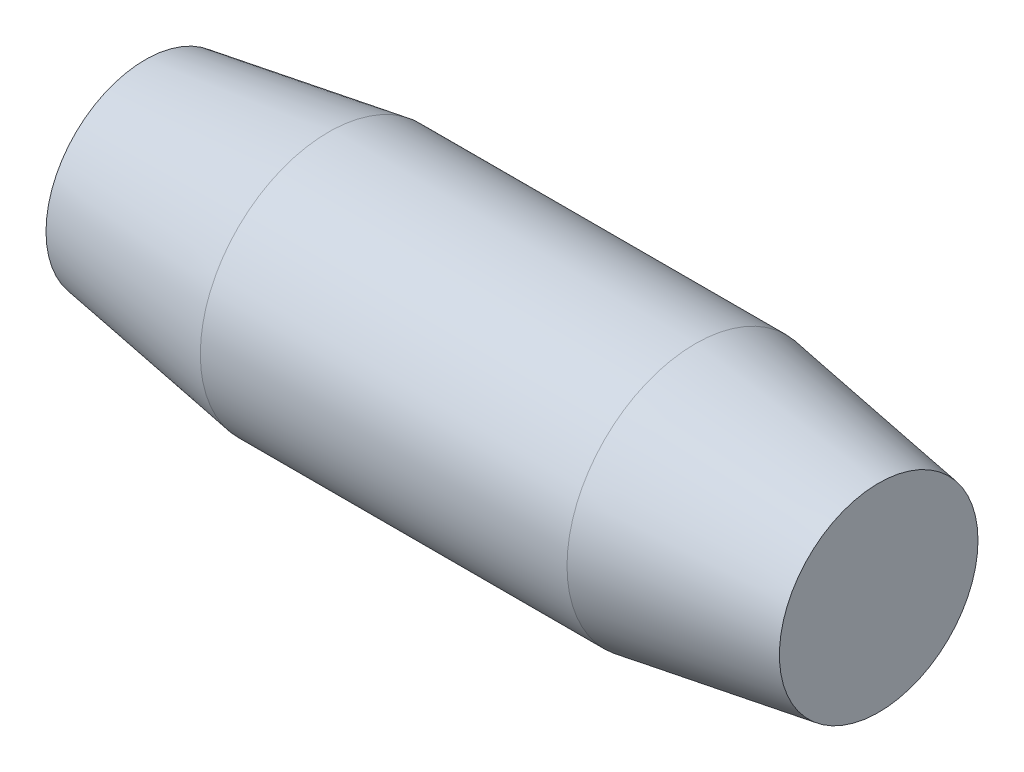
ISO-10303-21;
HEADER;
FILE_DESCRIPTION(('STEP AP214'),'2;1');
FILE_NAME('part.step','',(''),(''),'','','');
FILE_SCHEMA(('AUTOMOTIVE_DESIGN { 1 0 10303 214 1 1 1 1 }'));
ENDSEC;
DATA;
#1=APPLICATION_CONTEXT('core data for automotive mechanical design processes');
#2=APPLICATION_PROTOCOL_DEFINITION('international standard','automotive_design',2000,#1);
#3=PRODUCT_CONTEXT('',#1,'mechanical');
#4=PRODUCT('Part','Part','',(#3));
#5=PRODUCT_RELATED_PRODUCT_CATEGORY('part','',(#4));
#6=PRODUCT_DEFINITION_FORMATION('','',#4);
#7=PRODUCT_DEFINITION_CONTEXT('part definition',#1,'design');
#8=PRODUCT_DEFINITION('design','',#6,#7);
#9=PRODUCT_DEFINITION_SHAPE('','',#8);
#10=(LENGTH_UNIT() NAMED_UNIT(*) SI_UNIT(.MILLI.,.METRE.));
#11=(NAMED_UNIT(*) PLANE_ANGLE_UNIT() SI_UNIT($,.RADIAN.));
#12=(NAMED_UNIT(*) SI_UNIT($,.STERADIAN.) SOLID_ANGLE_UNIT());
#13=UNCERTAINTY_MEASURE_WITH_UNIT(LENGTH_MEASURE(1.E-05),#10,'distance_accuracy_value','');
#14=(GEOMETRIC_REPRESENTATION_CONTEXT(3) GLOBAL_UNCERTAINTY_ASSIGNED_CONTEXT((#13)) GLOBAL_UNIT_ASSIGNED_CONTEXT((#10,
#11,#12)) REPRESENTATION_CONTEXT('',''));
#15=CARTESIAN_POINT('',(0.,0.,0.));
#16=DIRECTION('',(0.,0.,1.));
#17=DIRECTION('',(1.,0.,0.));
#18=AXIS2_PLACEMENT_3D('',#15,#16,#17);
#19=CARTESIAN_POINT('',(9.525,0.,0.));
#20=DIRECTION('',(-1.,0.,0.));
#21=DIRECTION('',(0.,0.,1.));
#22=AXIS2_PLACEMENT_3D('',#19,#20,#21);
#23=CYLINDRICAL_SURFACE('',#22,6.6675);
#24=CARTESIAN_POINT('',(9.525,0.,0.));
#25=DIRECTION('',(1.,0.,0.));
#26=DIRECTION('',(0.,0.,-1.));
#27=AXIS2_PLACEMENT_3D('',#24,#25,#26);
#28=CIRCLE('',#27,6.6675);
#29=CARTESIAN_POINT('',(9.525,0.,6.6675));
#30=VERTEX_POINT('',#29);
#31=EDGE_CURVE('E10',#30,#30,#28,.T.);
#32=CARTESIAN_POINT('',(-9.525,0.,0.));
#33=DIRECTION('',(1.,0.,0.));
#34=DIRECTION('',(0.,0.,-1.));
#35=AXIS2_PLACEMENT_3D('',#32,#33,#34);
#36=CIRCLE('',#35,6.6675);
#37=CARTESIAN_POINT('',(-9.525,0.,6.6675));
#38=VERTEX_POINT('',#37);
#39=EDGE_CURVE('E51',#38,#38,#36,.T.);
#40=CARTESIAN_POINT('',(9.525,0.,6.6675));
#41=CARTESIAN_POINT('',(9.3265625,0.,6.6675));
#42=CARTESIAN_POINT('',(9.128125,0.,6.6675));
#43=CARTESIAN_POINT('',(8.73125,0.,6.6675));
#44=CARTESIAN_POINT('',(8.5328125,0.,6.6675));
#45=CARTESIAN_POINT('',(8.1359375,0.,6.6675));
#46=CARTESIAN_POINT('',(7.9375,0.,6.6675));
#47=CARTESIAN_POINT('',(7.540625,0.,6.6675));
#48=CARTESIAN_POINT('',(7.3421875,0.,6.6675));
#49=CARTESIAN_POINT('',(6.9453125,0.,6.6675));
#50=CARTESIAN_POINT('',(6.746875,0.,6.6675));
#51=CARTESIAN_POINT('',(6.35,0.,6.6675));
#52=CARTESIAN_POINT('',(6.1515625,0.,6.6675));
#53=CARTESIAN_POINT('',(5.7546875,0.,6.6675));
#54=CARTESIAN_POINT('',(5.55625,0.,6.6675));
#55=CARTESIAN_POINT('',(5.159375,0.,6.6675));
#56=CARTESIAN_POINT('',(4.9609375,0.,6.6675));
#57=CARTESIAN_POINT('',(4.5640625,0.,6.6675));
#58=CARTESIAN_POINT('',(4.365625,0.,6.6675));
#59=CARTESIAN_POINT('',(3.96875,0.,6.6675));
#60=CARTESIAN_POINT('',(3.7703125,0.,6.6675));
#61=CARTESIAN_POINT('',(3.3734375,0.,6.6675));
#62=CARTESIAN_POINT('',(3.175,0.,6.6675));
#63=CARTESIAN_POINT('',(2.778125,0.,6.6675));
#64=CARTESIAN_POINT('',(2.5796875,0.,6.6675));
#65=CARTESIAN_POINT('',(2.1828125,0.,6.6675));
#66=CARTESIAN_POINT('',(1.984375,0.,6.6675));
#67=CARTESIAN_POINT('',(1.5875,0.,6.6675));
#68=CARTESIAN_POINT('',(1.3890625,0.,6.6675));
#69=CARTESIAN_POINT('',(0.992187500000001,0.,6.6675));
#70=CARTESIAN_POINT('',(0.793750000000001,0.,6.6675));
#71=CARTESIAN_POINT('',(0.396875,0.,6.6675));
#72=CARTESIAN_POINT('',(0.1984375,0.,6.6675));
#73=CARTESIAN_POINT('',(-0.1984375,0.,6.6675));
#74=CARTESIAN_POINT('',(-0.396875,0.,6.6675));
#75=CARTESIAN_POINT('',(-0.793750000000001,0.,6.6675));
#76=CARTESIAN_POINT('',(-0.992187500000001,0.,6.6675));
#77=CARTESIAN_POINT('',(-1.3890625,0.,6.6675));
#78=CARTESIAN_POINT('',(-1.5875,0.,6.6675));
#79=CARTESIAN_POINT('',(-1.984375,0.,6.6675));
#80=CARTESIAN_POINT('',(-2.1828125,0.,6.6675));
#81=CARTESIAN_POINT('',(-2.5796875,0.,6.6675));
#82=CARTESIAN_POINT('',(-2.778125,0.,6.6675));
#83=CARTESIAN_POINT('',(-3.175,0.,6.6675));
#84=CARTESIAN_POINT('',(-3.3734375,0.,6.6675));
#85=CARTESIAN_POINT('',(-3.7703125,0.,6.6675));
#86=CARTESIAN_POINT('',(-3.96875,0.,6.6675));
#87=CARTESIAN_POINT('',(-4.365625,0.,6.6675));
#88=CARTESIAN_POINT('',(-4.5640625,0.,6.6675));
#89=CARTESIAN_POINT('',(-4.9609375,0.,6.6675));
#90=CARTESIAN_POINT('',(-5.159375,0.,6.6675));
#91=CARTESIAN_POINT('',(-5.55625,0.,6.6675));
#92=CARTESIAN_POINT('',(-5.7546875,0.,6.6675));
#93=CARTESIAN_POINT('',(-6.1515625,0.,6.6675));
#94=CARTESIAN_POINT('',(-6.35,0.,6.6675));
#95=CARTESIAN_POINT('',(-6.746875,0.,6.6675));
#96=CARTESIAN_POINT('',(-6.9453125,0.,6.6675));
#97=CARTESIAN_POINT('',(-7.3421875,0.,6.6675));
#98=CARTESIAN_POINT('',(-7.540625,0.,6.6675));
#99=CARTESIAN_POINT('',(-7.9375,0.,6.6675));
#100=CARTESIAN_POINT('',(-8.1359375,0.,6.6675));
#101=CARTESIAN_POINT('',(-8.5328125,0.,6.6675));
#102=CARTESIAN_POINT('',(-8.73125,0.,6.6675));
#103=CARTESIAN_POINT('',(-9.128125,0.,6.6675));
#104=CARTESIAN_POINT('',(-9.3265625,0.,6.6675));
#105=CARTESIAN_POINT('',(-9.525,0.,6.6675));
#106=B_SPLINE_CURVE_WITH_KNOTS('',3,(#40,#41,#42,#43,#44,#45,#46,#47,#48,#49,#50,#51,#52,#53,
#54,#55,#56,#57,#58,#59,#60,#61,#62,#63,#64,#65,#66,#67,#68,#69,#70,#71,#72,#73,#74,#75,#76,#77,
#78,#79,#80,#81,#82,#83,#84,#85,#86,#87,#88,#89,#90,#91,#92,#93,#94,#95,#96,#97,#98,#99,#100,
#101,#102,#103,#104,#105),.UNSPECIFIED.,.F.,.F.,(4,2,2,2,2,2,2,2,2,2,2,2,2,2,2,2,2,2,2,2,2,2,2,
2,2,2,2,2,2,2,2,2,4),(0.,0.5953125,1.190625,1.7859375,2.38125,2.9765625,3.571875,4.1671875,
4.7625,5.3578125,5.953125,6.5484375,7.14375,7.7390625,8.334375,8.9296875,9.525,10.1203125,
10.715625,11.3109375,11.90625,12.5015625,13.096875,13.6921875,14.2875,14.8828125,15.478125,
16.0734375,16.66875,17.2640625,17.859375,18.4546875,19.05),.UNSPECIFIED.);
#107=EDGE_CURVE('BSEAM37',#30,#38,#106,.T.);
#108=ORIENTED_EDGE('',*,*,#31,.F.);
#109=ORIENTED_EDGE('',*,*,#39,.T.);
#110=ORIENTED_EDGE('',*,*,#107,.T.);
#111=ORIENTED_EDGE('',*,*,#107,.F.);
#112=EDGE_LOOP('',(#108,#110,#109,#111));
#113=FACE_BOUND('',#112,.T.);
#114=ADVANCED_FACE('F37',(#113),#23,.T.);
#115=CARTESIAN_POINT('',(9.525,0.,0.));
#116=DIRECTION('',(-1.,0.,0.));
#117=DIRECTION('',(0.,0.,-1.));
#118=AXIS2_PLACEMENT_3D('',#115,#116,#117);
#119=CONICAL_SURFACE('',#118,6.6675,0.15707963267949);
#120=CARTESIAN_POINT('',(19.05,0.,0.));
#121=DIRECTION('',(1.,0.,0.));
#122=DIRECTION('',(0.,0.,-1.));
#123=AXIS2_PLACEMENT_3D('',#120,#121,#122);
#124=CIRCLE('',#123,5.15888820590879);
#125=CARTESIAN_POINT('',(19.05,0.,-5.15888820590879));
#126=VERTEX_POINT('',#125);
#127=EDGE_CURVE('E43',#126,#126,#124,.T.);
#128=ORIENTED_EDGE('',*,*,#127,.F.);
#129=EDGE_LOOP('',(#128));
#130=FACE_BOUND('',#129,.T.);
#131=ORIENTED_EDGE('',*,*,#31,.T.);
#132=EDGE_LOOP('',(#131));
#133=FACE_BOUND('',#132,.T.);
#134=ADVANCED_FACE('F70',(#130,#133),#119,.T.);
#135=CARTESIAN_POINT('',(19.05,0.,0.));
#136=DIRECTION('',(1.,0.,0.));
#137=DIRECTION('',(0.,0.,-1.));
#138=AXIS2_PLACEMENT_3D('',#135,#136,#137);
#139=PLANE('',#138);
#140=ORIENTED_EDGE('',*,*,#127,.T.);
#141=EDGE_LOOP('',(#140));
#142=FACE_BOUND('',#141,.T.);
#143=ADVANCED_FACE('F61',(#142),#139,.T.);
#144=CARTESIAN_POINT('',(-9.525,0.,0.));
#145=DIRECTION('',(1.,0.,0.));
#146=DIRECTION('',(0.,0.,-1.));
#147=AXIS2_PLACEMENT_3D('',#144,#145,#146);
#148=CONICAL_SURFACE('',#147,6.6675,0.15707963267949);
#149=CARTESIAN_POINT('',(-19.05,0.,0.));
#150=DIRECTION('',(-1.,0.,0.));
#151=DIRECTION('',(0.,0.,1.));
#152=AXIS2_PLACEMENT_3D('',#149,#150,#151);
#153=CIRCLE('',#152,5.15888820590879);
#154=CARTESIAN_POINT('',(-19.05,0.,5.15888820590879));
#155=VERTEX_POINT('',#154);
#156=EDGE_CURVE('E47',#155,#155,#153,.F.);
#157=ORIENTED_EDGE('',*,*,#156,.T.);
#158=EDGE_LOOP('',(#157));
#159=FACE_BOUND('',#158,.T.);
#160=ORIENTED_EDGE('',*,*,#39,.F.);
#161=EDGE_LOOP('',(#160));
#162=FACE_BOUND('',#161,.T.);
#163=ADVANCED_FACE('F58',(#159,#162),#148,.T.);
#164=CARTESIAN_POINT('',(-19.05,0.,0.));
#165=DIRECTION('',(-1.,0.,0.));
#166=DIRECTION('',(0.,0.,-1.));
#167=AXIS2_PLACEMENT_3D('',#164,#165,#166);
#168=PLANE('',#167);
#169=ORIENTED_EDGE('',*,*,#156,.F.);
#170=EDGE_LOOP('',(#169));
#171=FACE_BOUND('',#170,.T.);
#172=ADVANCED_FACE('F60',(#171),#168,.T.);
#173=CLOSED_SHELL('',(#114,#134,#143,#163,#172));
#174=MANIFOLD_SOLID_BREP('B2',#173);
#175=ADVANCED_BREP_SHAPE_REPRESENTATION('',(#18,#174),#14);
#176=SHAPE_DEFINITION_REPRESENTATION(#9,#175);
ENDSEC;
END-ISO-10303-21;
